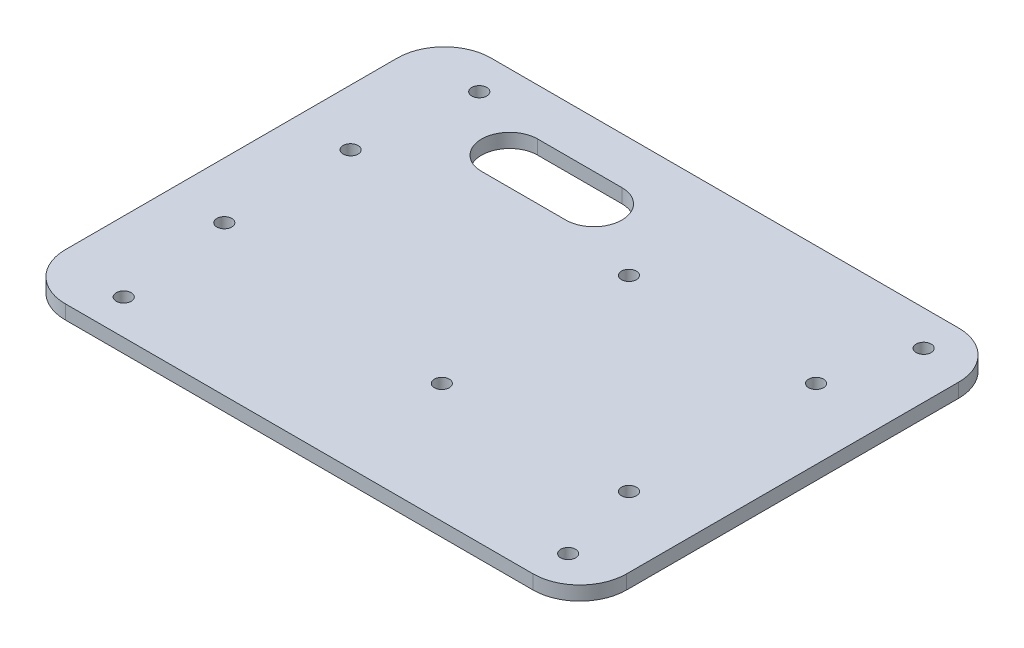
ISO-10303-21;
HEADER;
FILE_DESCRIPTION(('STEP AP214'),'2;1');
FILE_NAME('part.step','',(''),(''),'','','');
FILE_SCHEMA(('AUTOMOTIVE_DESIGN { 1 0 10303 214 1 1 1 1 }'));
ENDSEC;
DATA;
#1=APPLICATION_CONTEXT('core data for automotive mechanical design processes');
#2=APPLICATION_PROTOCOL_DEFINITION('international standard','automotive_design',2000,#1);
#3=PRODUCT_CONTEXT('',#1,'mechanical');
#4=PRODUCT('Part','Part','',(#3));
#5=PRODUCT_RELATED_PRODUCT_CATEGORY('part','',(#4));
#6=PRODUCT_DEFINITION_FORMATION('','',#4);
#7=PRODUCT_DEFINITION_CONTEXT('part definition',#1,'design');
#8=PRODUCT_DEFINITION('design','',#6,#7);
#9=PRODUCT_DEFINITION_SHAPE('','',#8);
#10=(LENGTH_UNIT() NAMED_UNIT(*) SI_UNIT(.MILLI.,.METRE.));
#11=(NAMED_UNIT(*) PLANE_ANGLE_UNIT() SI_UNIT($,.RADIAN.));
#12=(NAMED_UNIT(*) SI_UNIT($,.STERADIAN.) SOLID_ANGLE_UNIT());
#13=UNCERTAINTY_MEASURE_WITH_UNIT(LENGTH_MEASURE(1.E-05),#10,'distance_accuracy_value','');
#14=(GEOMETRIC_REPRESENTATION_CONTEXT(3) GLOBAL_UNCERTAINTY_ASSIGNED_CONTEXT((#13)) GLOBAL_UNIT_ASSIGNED_CONTEXT((#10,
#11,#12)) REPRESENTATION_CONTEXT('',''));
#15=CARTESIAN_POINT('',(0.,0.,0.));
#16=DIRECTION('',(0.,0.,1.));
#17=DIRECTION('',(1.,0.,0.));
#18=AXIS2_PLACEMENT_3D('',#15,#16,#17);
#19=CARTESIAN_POINT('',(-50.,3.,35.5));
#20=DIRECTION('',(0.,-1.,0.));
#21=DIRECTION('',(0.,0.,-1.));
#22=AXIS2_PLACEMENT_3D('',#19,#20,#21);
#23=CYLINDRICAL_SURFACE('',#22,10.);
#24=CARTESIAN_POINT('',(-50.,0.,35.5));
#25=DIRECTION('',(0.,-1.,0.));
#26=DIRECTION('',(0.,0.,-1.));
#27=AXIS2_PLACEMENT_3D('',#24,#25,#26);
#28=CIRCLE('',#27,10.);
#29=CARTESIAN_POINT('',(-49.9999999999999,0.,45.5));
#30=VERTEX_POINT('',#29);
#31=CARTESIAN_POINT('',(-60.,0.,35.4999999999999));
#32=VERTEX_POINT('',#31);
#33=EDGE_CURVE('E247',#30,#32,#28,.T.);
#34=ORIENTED_EDGE('',*,*,#33,.F.);
#35=DIRECTION('',(0.,-1.,0.));
#36=VECTOR('',#35,1.);
#37=CARTESIAN_POINT('',(-49.9999999999999,3.,45.5));
#38=LINE('',#37,#36);
#39=CARTESIAN_POINT('',(-49.9999999999999,3.,45.5));
#40=VERTEX_POINT('',#39);
#41=EDGE_CURVE('E11',#40,#30,#38,.T.);
#42=ORIENTED_EDGE('',*,*,#41,.F.);
#43=CARTESIAN_POINT('',(-50.,3.,35.5));
#44=DIRECTION('',(0.,-1.,0.));
#45=DIRECTION('',(0.,0.,-1.));
#46=AXIS2_PLACEMENT_3D('',#43,#44,#45);
#47=CIRCLE('',#46,10.);
#48=CARTESIAN_POINT('',(-60.,3.,35.4999999999999));
#49=VERTEX_POINT('',#48);
#50=EDGE_CURVE('E251',#40,#49,#47,.T.);
#51=ORIENTED_EDGE('',*,*,#50,.T.);
#52=DIRECTION('',(0.,-1.,0.));
#53=VECTOR('',#52,1.);
#54=CARTESIAN_POINT('',(-60.,3.,35.4999999999999));
#55=LINE('',#54,#53);
#56=EDGE_CURVE('E47',#49,#32,#55,.T.);
#57=ORIENTED_EDGE('',*,*,#56,.T.);
#58=EDGE_LOOP('',(#34,#42,#51,#57));
#59=FACE_BOUND('',#58,.T.);
#60=ADVANCED_FACE('F44',(#59),#23,.T.);
#61=CARTESIAN_POINT('',(-49.9999999999999,3.,45.5));
#62=DIRECTION('',(0.,0.,-1.));
#63=DIRECTION('',(-1.,0.,0.));
#64=AXIS2_PLACEMENT_3D('',#61,#62,#63);
#65=PLANE('',#64);
#66=DIRECTION('',(1.,0.,0.));
#67=VECTOR('',#66,1.);
#68=CARTESIAN_POINT('',(-49.9999999999999,0.,45.5));
#69=LINE('',#68,#67);
#70=CARTESIAN_POINT('',(49.9999999999999,0.,45.5));
#71=VERTEX_POINT('',#70);
#72=EDGE_CURVE('E256',#30,#71,#69,.T.);
#73=ORIENTED_EDGE('',*,*,#72,.T.);
#74=DIRECTION('',(0.,-1.,0.));
#75=VECTOR('',#74,1.);
#76=CARTESIAN_POINT('',(49.9999999999999,3.,45.5));
#77=LINE('',#76,#75);
#78=CARTESIAN_POINT('',(49.9999999999999,3.,45.5));
#79=VERTEX_POINT('',#78);
#80=EDGE_CURVE('E53',#79,#71,#77,.T.);
#81=ORIENTED_EDGE('',*,*,#80,.F.);
#82=DIRECTION('',(1.,0.,0.));
#83=VECTOR('',#82,1.);
#84=CARTESIAN_POINT('',(-49.9999999999999,3.,45.5));
#85=LINE('',#84,#83);
#86=EDGE_CURVE('E278',#40,#79,#85,.T.);
#87=ORIENTED_EDGE('',*,*,#86,.F.);
#88=ORIENTED_EDGE('',*,*,#41,.T.);
#89=EDGE_LOOP('',(#73,#81,#87,#88));
#90=FACE_BOUND('',#89,.T.);
#91=ADVANCED_FACE('F341',(#90),#65,.F.);
#92=CARTESIAN_POINT('',(50.,3.,35.5));
#93=DIRECTION('',(0.,-1.,0.));
#94=DIRECTION('',(0.,0.,-1.));
#95=AXIS2_PLACEMENT_3D('',#92,#93,#94);
#96=CYLINDRICAL_SURFACE('',#95,10.);
#97=CARTESIAN_POINT('',(50.,0.,35.5));
#98=DIRECTION('',(0.,1.,0.));
#99=DIRECTION('',(0.,0.,1.));
#100=AXIS2_PLACEMENT_3D('',#97,#98,#99);
#101=CIRCLE('',#100,10.);
#102=CARTESIAN_POINT('',(60.,0.,35.4999999999999));
#103=VERTEX_POINT('',#102);
#104=EDGE_CURVE('E304',#71,#103,#101,.T.);
#105=ORIENTED_EDGE('',*,*,#104,.T.);
#106=DIRECTION('',(0.,-1.,0.));
#107=VECTOR('',#106,1.);
#108=CARTESIAN_POINT('',(60.,3.,35.4999999999999));
#109=LINE('',#108,#107);
#110=CARTESIAN_POINT('',(60.,3.,35.4999999999999));
#111=VERTEX_POINT('',#110);
#112=EDGE_CURVE('E312',#111,#103,#109,.T.);
#113=ORIENTED_EDGE('',*,*,#112,.F.);
#114=CARTESIAN_POINT('',(50.,3.,35.5));
#115=DIRECTION('',(0.,1.,0.));
#116=DIRECTION('',(0.,0.,1.));
#117=AXIS2_PLACEMENT_3D('',#114,#115,#116);
#118=CIRCLE('',#117,10.);
#119=EDGE_CURVE('E275',#79,#111,#118,.T.);
#120=ORIENTED_EDGE('',*,*,#119,.F.);
#121=ORIENTED_EDGE('',*,*,#80,.T.);
#122=EDGE_LOOP('',(#105,#113,#120,#121));
#123=FACE_BOUND('',#122,.T.);
#124=ADVANCED_FACE('F345',(#123),#96,.T.);
#125=CARTESIAN_POINT('',(60.,3.,35.4999999999999));
#126=DIRECTION('',(-1.,0.,0.));
#127=DIRECTION('',(0.,0.,1.));
#128=AXIS2_PLACEMENT_3D('',#125,#126,#127);
#129=PLANE('',#128);
#130=DIRECTION('',(0.,0.,-1.));
#131=VECTOR('',#130,1.);
#132=CARTESIAN_POINT('',(60.,0.,35.4999999999999));
#133=LINE('',#132,#131);
#134=CARTESIAN_POINT('',(60.,0.,-35.4999999999999));
#135=VERTEX_POINT('',#134);
#136=EDGE_CURVE('E300',#103,#135,#133,.T.);
#137=ORIENTED_EDGE('',*,*,#136,.T.);
#138=DIRECTION('',(0.,-1.,0.));
#139=VECTOR('',#138,1.);
#140=CARTESIAN_POINT('',(60.,3.,-35.4999999999999));
#141=LINE('',#140,#139);
#142=CARTESIAN_POINT('',(60.,3.,-35.4999999999999));
#143=VERTEX_POINT('',#142);
#144=EDGE_CURVE('E316',#143,#135,#141,.T.);
#145=ORIENTED_EDGE('',*,*,#144,.F.);
#146=DIRECTION('',(0.,0.,-1.));
#147=VECTOR('',#146,1.);
#148=CARTESIAN_POINT('',(60.,3.,35.4999999999999));
#149=LINE('',#148,#147);
#150=EDGE_CURVE('E272',#111,#143,#149,.T.);
#151=ORIENTED_EDGE('',*,*,#150,.F.);
#152=ORIENTED_EDGE('',*,*,#112,.T.);
#153=EDGE_LOOP('',(#137,#145,#151,#152));
#154=FACE_BOUND('',#153,.T.);
#155=ADVANCED_FACE('F363',(#154),#129,.F.);
#156=CARTESIAN_POINT('',(50.,3.,-35.5));
#157=DIRECTION('',(0.,-1.,0.));
#158=DIRECTION('',(0.,0.,-1.));
#159=AXIS2_PLACEMENT_3D('',#156,#157,#158);
#160=CYLINDRICAL_SURFACE('',#159,10.);
#161=CARTESIAN_POINT('',(50.,0.,-35.5));
#162=DIRECTION('',(0.,-1.,0.));
#163=DIRECTION('',(0.,0.,-1.));
#164=AXIS2_PLACEMENT_3D('',#161,#162,#163);
#165=CIRCLE('',#164,10.);
#166=CARTESIAN_POINT('',(49.9999999999999,0.,-45.5));
#167=VERTEX_POINT('',#166);
#168=EDGE_CURVE('E296',#167,#135,#165,.T.);
#169=ORIENTED_EDGE('',*,*,#168,.F.);
#170=DIRECTION('',(0.,-1.,0.));
#171=VECTOR('',#170,1.);
#172=CARTESIAN_POINT('',(49.9999999999999,3.,-45.5));
#173=LINE('',#172,#171);
#174=CARTESIAN_POINT('',(49.9999999999999,3.,-45.5));
#175=VERTEX_POINT('',#174);
#176=EDGE_CURVE('E319',#175,#167,#173,.T.);
#177=ORIENTED_EDGE('',*,*,#176,.F.);
#178=CARTESIAN_POINT('',(50.,3.,-35.5));
#179=DIRECTION('',(0.,-1.,0.));
#180=DIRECTION('',(0.,0.,-1.));
#181=AXIS2_PLACEMENT_3D('',#178,#179,#180);
#182=CIRCLE('',#181,10.);
#183=EDGE_CURVE('E268',#175,#143,#182,.T.);
#184=ORIENTED_EDGE('',*,*,#183,.T.);
#185=ORIENTED_EDGE('',*,*,#144,.T.);
#186=EDGE_LOOP('',(#169,#177,#184,#185));
#187=FACE_BOUND('',#186,.T.);
#188=ADVANCED_FACE('F361',(#187),#160,.T.);
#189=CARTESIAN_POINT('',(-49.9999999999999,3.,-45.5));
#190=DIRECTION('',(0.,0.,-1.));
#191=DIRECTION('',(-1.,0.,0.));
#192=AXIS2_PLACEMENT_3D('',#189,#190,#191);
#193=PLANE('',#192);
#194=DIRECTION('',(1.,0.,0.));
#195=VECTOR('',#194,1.);
#196=CARTESIAN_POINT('',(-49.9999999999999,0.,-45.5));
#197=LINE('',#196,#195);
#198=CARTESIAN_POINT('',(-50.,0.,-45.5));
#199=VERTEX_POINT('',#198);
#200=EDGE_CURVE('E292',#199,#167,#197,.T.);
#201=ORIENTED_EDGE('',*,*,#200,.F.);
#202=DIRECTION('',(0.,-1.,0.));
#203=VECTOR('',#202,1.);
#204=CARTESIAN_POINT('',(-50.,3.,-45.5));
#205=LINE('',#204,#203);
#206=CARTESIAN_POINT('',(-50.,3.,-45.5));
#207=VERTEX_POINT('',#206);
#208=EDGE_CURVE('E322',#207,#199,#205,.T.);
#209=ORIENTED_EDGE('',*,*,#208,.F.);
#210=DIRECTION('',(1.,0.,0.));
#211=VECTOR('',#210,1.);
#212=CARTESIAN_POINT('',(-49.9999999999999,3.,-45.5));
#213=LINE('',#212,#211);
#214=EDGE_CURVE('E264',#207,#175,#213,.T.);
#215=ORIENTED_EDGE('',*,*,#214,.T.);
#216=ORIENTED_EDGE('',*,*,#176,.T.);
#217=EDGE_LOOP('',(#201,#209,#215,#216));
#218=FACE_BOUND('',#217,.T.);
#219=ADVANCED_FACE('F359',(#218),#193,.T.);
#220=CARTESIAN_POINT('',(-50.,3.,-35.5));
#221=DIRECTION('',(0.,-1.,0.));
#222=DIRECTION('',(0.,0.,-1.));
#223=AXIS2_PLACEMENT_3D('',#220,#221,#222);
#224=CYLINDRICAL_SURFACE('',#223,10.);
#225=CARTESIAN_POINT('',(-50.,0.,-35.5));
#226=DIRECTION('',(0.,-1.,0.));
#227=DIRECTION('',(0.,0.,-1.));
#228=AXIS2_PLACEMENT_3D('',#225,#226,#227);
#229=CIRCLE('',#228,10.);
#230=CARTESIAN_POINT('',(-60.,0.,-35.4999999999999));
#231=VERTEX_POINT('',#230);
#232=EDGE_CURVE('E288',#231,#199,#229,.T.);
#233=ORIENTED_EDGE('',*,*,#232,.F.);
#234=DIRECTION('',(0.,-1.,0.));
#235=VECTOR('',#234,1.);
#236=CARTESIAN_POINT('',(-60.,3.,-35.4999999999999));
#237=LINE('',#236,#235);
#238=CARTESIAN_POINT('',(-60.,3.,-35.4999999999999));
#239=VERTEX_POINT('',#238);
#240=EDGE_CURVE('E324',#239,#231,#237,.T.);
#241=ORIENTED_EDGE('',*,*,#240,.F.);
#242=CARTESIAN_POINT('',(-50.,3.,-35.5));
#243=DIRECTION('',(0.,-1.,0.));
#244=DIRECTION('',(0.,0.,-1.));
#245=AXIS2_PLACEMENT_3D('',#242,#243,#244);
#246=CIRCLE('',#245,10.);
#247=EDGE_CURVE('E260',#239,#207,#246,.T.);
#248=ORIENTED_EDGE('',*,*,#247,.T.);
#249=ORIENTED_EDGE('',*,*,#208,.T.);
#250=EDGE_LOOP('',(#233,#241,#248,#249));
#251=FACE_BOUND('',#250,.T.);
#252=ADVANCED_FACE('F355',(#251),#224,.T.);
#253=CARTESIAN_POINT('',(-60.,3.,35.4999999999999));
#254=DIRECTION('',(-1.,0.,0.));
#255=DIRECTION('',(0.,0.,1.));
#256=AXIS2_PLACEMENT_3D('',#253,#254,#255);
#257=PLANE('',#256);
#258=DIRECTION('',(0.,0.,-1.));
#259=VECTOR('',#258,1.);
#260=CARTESIAN_POINT('',(-60.,0.,35.4999999999999));
#261=LINE('',#260,#259);
#262=EDGE_CURVE('E284',#32,#231,#261,.T.);
#263=ORIENTED_EDGE('',*,*,#262,.F.);
#264=ORIENTED_EDGE('',*,*,#56,.F.);
#265=DIRECTION('',(0.,0.,-1.));
#266=VECTOR('',#265,1.);
#267=CARTESIAN_POINT('',(-60.,3.,35.4999999999999));
#268=LINE('',#267,#266);
#269=EDGE_CURVE('E255',#49,#239,#268,.T.);
#270=ORIENTED_EDGE('',*,*,#269,.T.);
#271=ORIENTED_EDGE('',*,*,#240,.T.);
#272=EDGE_LOOP('',(#263,#264,#270,#271));
#273=FACE_BOUND('',#272,.T.);
#274=ADVANCED_FACE('F334',(#273),#257,.T.);
#275=CARTESIAN_POINT('',(-50.,3.,35.5));
#276=DIRECTION('',(0.,-1.,0.));
#277=DIRECTION('',(0.,0.,-1.));
#278=AXIS2_PLACEMENT_3D('',#275,#276,#277);
#279=PLANE('',#278);
#280=CARTESIAN_POINT('',(-48.,3.,-13.5));
#281=DIRECTION('',(0.,1.,0.));
#282=DIRECTION('',(0.,0.,1.));
#283=AXIS2_PLACEMENT_3D('',#280,#281,#282);
#284=CIRCLE('',#283,1.6);
#285=CARTESIAN_POINT('',(-48.,3.,-11.9));
#286=VERTEX_POINT('',#285);
#287=EDGE_CURVE('E443',#286,#286,#284,.T.);
#288=ORIENTED_EDGE('',*,*,#287,.F.);
#289=EDGE_LOOP('',(#288));
#290=FACE_BOUND('',#289,.T.);
#291=CARTESIAN_POINT('',(-48.,3.,13.5));
#292=DIRECTION('',(0.,1.,0.));
#293=DIRECTION('',(0.,0.,1.));
#294=AXIS2_PLACEMENT_3D('',#291,#292,#293);
#295=CIRCLE('',#294,1.6);
#296=CARTESIAN_POINT('',(-48.,3.,15.1));
#297=VERTEX_POINT('',#296);
#298=EDGE_CURVE('E445',#297,#297,#295,.T.);
#299=ORIENTED_EDGE('',*,*,#298,.F.);
#300=EDGE_LOOP('',(#299));
#301=FACE_BOUND('',#300,.T.);
#302=DIRECTION('',(1.,0.,0.));
#303=VECTOR('',#302,1.);
#304=CARTESIAN_POINT('',(-30.,3.,-23.5));
#305=LINE('',#304,#303);
#306=CARTESIAN_POINT('',(-30.,3.,-23.5));
#307=VERTEX_POINT('',#306);
#308=CARTESIAN_POINT('',(-12.,3.,-23.5));
#309=VERTEX_POINT('',#308);
#310=EDGE_CURVE('E171',#307,#309,#305,.T.);
#311=ORIENTED_EDGE('',*,*,#310,.F.);
#312=CARTESIAN_POINT('',(-30.,3.,-29.5));
#313=DIRECTION('',(0.,1.,0.));
#314=DIRECTION('',(0.,0.,1.));
#315=AXIS2_PLACEMENT_3D('',#312,#313,#314);
#316=CIRCLE('',#315,6.00000000000001);
#317=CARTESIAN_POINT('',(-30.,3.,-35.5));
#318=VERTEX_POINT('',#317);
#319=EDGE_CURVE('E61',#318,#307,#316,.T.);
#320=ORIENTED_EDGE('',*,*,#319,.F.);
#321=DIRECTION('',(-1.,0.,0.));
#322=VECTOR('',#321,1.);
#323=CARTESIAN_POINT('',(-30.,3.,-35.5));
#324=LINE('',#323,#322);
#325=CARTESIAN_POINT('',(-12.,3.,-35.5));
#326=VERTEX_POINT('',#325);
#327=EDGE_CURVE('E155',#326,#318,#324,.T.);
#328=ORIENTED_EDGE('',*,*,#327,.F.);
#329=CARTESIAN_POINT('',(-12.,3.,-29.5));
#330=DIRECTION('',(0.,1.,0.));
#331=DIRECTION('',(0.,0.,1.));
#332=AXIS2_PLACEMENT_3D('',#329,#330,#331);
#333=CIRCLE('',#332,6.);
#334=EDGE_CURVE('E159',#309,#326,#333,.T.);
#335=ORIENTED_EDGE('',*,*,#334,.F.);
#336=EDGE_LOOP('',(#311,#320,#328,#335));
#337=FACE_BOUND('',#336,.T.);
#338=CARTESIAN_POINT('',(45.,3.,20.));
#339=DIRECTION('',(0.,1.,0.));
#340=DIRECTION('',(0.,0.,1.));
#341=AXIS2_PLACEMENT_3D('',#338,#339,#340);
#342=CIRCLE('',#341,1.6);
#343=CARTESIAN_POINT('',(45.,3.,21.6));
#344=VERTEX_POINT('',#343);
#345=EDGE_CURVE('E195',#344,#344,#342,.T.);
#346=ORIENTED_EDGE('',*,*,#345,.F.);
#347=EDGE_LOOP('',(#346));
#348=FACE_BOUND('',#347,.T.);
#349=CARTESIAN_POINT('',(5.,3.,-20.));
#350=DIRECTION('',(0.,1.,0.));
#351=DIRECTION('',(0.,0.,1.));
#352=AXIS2_PLACEMENT_3D('',#349,#350,#351);
#353=CIRCLE('',#352,1.6);
#354=CARTESIAN_POINT('',(5.,3.,-18.4));
#355=VERTEX_POINT('',#354);
#356=EDGE_CURVE('E204',#355,#355,#353,.T.);
#357=ORIENTED_EDGE('',*,*,#356,.F.);
#358=EDGE_LOOP('',(#357));
#359=FACE_BOUND('',#358,.T.);
#360=CARTESIAN_POINT('',(5.,3.,20.));
#361=DIRECTION('',(0.,1.,0.));
#362=DIRECTION('',(0.,0.,1.));
#363=AXIS2_PLACEMENT_3D('',#360,#361,#362);
#364=CIRCLE('',#363,1.6);
#365=CARTESIAN_POINT('',(5.,3.,21.6));
#366=VERTEX_POINT('',#365);
#367=EDGE_CURVE('E187',#366,#366,#364,.T.);
#368=ORIENTED_EDGE('',*,*,#367,.F.);
#369=EDGE_LOOP('',(#368));
#370=FACE_BOUND('',#369,.T.);
#371=CARTESIAN_POINT('',(45.,3.,-20.));
#372=DIRECTION('',(0.,1.,0.));
#373=DIRECTION('',(0.,0.,1.));
#374=AXIS2_PLACEMENT_3D('',#371,#372,#373);
#375=CIRCLE('',#374,1.6);
#376=CARTESIAN_POINT('',(45.,3.,-18.4));
#377=VERTEX_POINT('',#376);
#378=EDGE_CURVE('E199',#377,#377,#375,.T.);
#379=ORIENTED_EDGE('',*,*,#378,.F.);
#380=EDGE_LOOP('',(#379));
#381=FACE_BOUND('',#380,.T.);
#382=CARTESIAN_POINT('',(-45.,3.,38.));
#383=DIRECTION('',(0.,1.,0.));
#384=DIRECTION('',(0.,0.,1.));
#385=AXIS2_PLACEMENT_3D('',#382,#383,#384);
#386=CIRCLE('',#385,1.6);
#387=CARTESIAN_POINT('',(-45.,3.,39.6));
#388=VERTEX_POINT('',#387);
#389=EDGE_CURVE('E236',#388,#388,#386,.T.);
#390=ORIENTED_EDGE('',*,*,#389,.F.);
#391=EDGE_LOOP('',(#390));
#392=FACE_BOUND('',#391,.T.);
#393=CARTESIAN_POINT('',(-45.,3.,-38.));
#394=DIRECTION('',(0.,1.,0.));
#395=DIRECTION('',(0.,0.,1.));
#396=AXIS2_PLACEMENT_3D('',#393,#394,#395);
#397=CIRCLE('',#396,1.6);
#398=CARTESIAN_POINT('',(-45.,3.,-36.4));
#399=VERTEX_POINT('',#398);
#400=EDGE_CURVE('E228',#399,#399,#397,.T.);
#401=ORIENTED_EDGE('',*,*,#400,.F.);
#402=EDGE_LOOP('',(#401));
#403=FACE_BOUND('',#402,.T.);
#404=CARTESIAN_POINT('',(50.,3.,-38.));
#405=DIRECTION('',(0.,1.,0.));
#406=DIRECTION('',(0.,0.,1.));
#407=AXIS2_PLACEMENT_3D('',#404,#405,#406);
#408=CIRCLE('',#407,1.6);
#409=CARTESIAN_POINT('',(50.,3.,-36.4));
#410=VERTEX_POINT('',#409);
#411=EDGE_CURVE('E219',#410,#410,#408,.T.);
#412=ORIENTED_EDGE('',*,*,#411,.F.);
#413=EDGE_LOOP('',(#412));
#414=FACE_BOUND('',#413,.T.);
#415=CARTESIAN_POINT('',(50.,3.,38.));
#416=DIRECTION('',(0.,1.,0.));
#417=DIRECTION('',(0.,0.,1.));
#418=AXIS2_PLACEMENT_3D('',#415,#416,#417);
#419=CIRCLE('',#418,1.6);
#420=CARTESIAN_POINT('',(50.,3.,39.6));
#421=VERTEX_POINT('',#420);
#422=EDGE_CURVE('E223',#421,#421,#419,.T.);
#423=ORIENTED_EDGE('',*,*,#422,.F.);
#424=EDGE_LOOP('',(#423));
#425=FACE_BOUND('',#424,.T.);
#426=ORIENTED_EDGE('',*,*,#50,.F.);
#427=ORIENTED_EDGE('',*,*,#86,.T.);
#428=ORIENTED_EDGE('',*,*,#119,.T.);
#429=ORIENTED_EDGE('',*,*,#150,.T.);
#430=ORIENTED_EDGE('',*,*,#183,.F.);
#431=ORIENTED_EDGE('',*,*,#214,.F.);
#432=ORIENTED_EDGE('',*,*,#247,.F.);
#433=ORIENTED_EDGE('',*,*,#269,.F.);
#434=EDGE_LOOP('',(#426,#427,#428,#429,#430,#431,#432,#433));
#435=FACE_BOUND('',#434,.T.);
#436=ADVANCED_FACE('F349',(#290,#301,#337,#348,#359,#370,#381,#392,#403,#414,#425,#435),#279,.F.);
#437=CARTESIAN_POINT('',(-50.,0.,35.5));
#438=DIRECTION('',(0.,-1.,0.));
#439=DIRECTION('',(0.,0.,-1.));
#440=AXIS2_PLACEMENT_3D('',#437,#438,#439);
#441=PLANE('',#440);
#442=CARTESIAN_POINT('',(-48.,0.,-13.5));
#443=DIRECTION('',(0.,1.,0.));
#444=DIRECTION('',(0.,0.,1.));
#445=AXIS2_PLACEMENT_3D('',#442,#443,#444);
#446=CIRCLE('',#445,1.6);
#447=CARTESIAN_POINT('',(-48.,0.,-11.9));
#448=VERTEX_POINT('',#447);
#449=EDGE_CURVE('E172',#448,#448,#446,.T.);
#450=ORIENTED_EDGE('',*,*,#449,.T.);
#451=EDGE_LOOP('',(#450));
#452=FACE_BOUND('',#451,.T.);
#453=CARTESIAN_POINT('',(-48.,0.,13.5));
#454=DIRECTION('',(0.,1.,0.));
#455=DIRECTION('',(0.,0.,1.));
#456=AXIS2_PLACEMENT_3D('',#453,#454,#455);
#457=CIRCLE('',#456,1.6);
#458=CARTESIAN_POINT('',(-48.,0.,15.1));
#459=VERTEX_POINT('',#458);
#460=EDGE_CURVE('E162',#459,#459,#457,.T.);
#461=ORIENTED_EDGE('',*,*,#460,.T.);
#462=EDGE_LOOP('',(#461));
#463=FACE_BOUND('',#462,.T.);
#464=CARTESIAN_POINT('',(-30.,0.,-29.5));
#465=DIRECTION('',(0.,1.,0.));
#466=DIRECTION('',(0.,0.,1.));
#467=AXIS2_PLACEMENT_3D('',#464,#465,#466);
#468=CIRCLE('',#467,6.00000000000001);
#469=CARTESIAN_POINT('',(-30.,0.,-35.5));
#470=VERTEX_POINT('',#469);
#471=CARTESIAN_POINT('',(-30.,0.,-23.5));
#472=VERTEX_POINT('',#471);
#473=EDGE_CURVE('E136',#470,#472,#468,.T.);
#474=ORIENTED_EDGE('',*,*,#473,.T.);
#475=DIRECTION('',(1.,0.,0.));
#476=VECTOR('',#475,1.);
#477=CARTESIAN_POINT('',(-30.,0.,-23.5));
#478=LINE('',#477,#476);
#479=CARTESIAN_POINT('',(-12.,0.,-23.5));
#480=VERTEX_POINT('',#479);
#481=EDGE_CURVE('E146',#472,#480,#478,.T.);
#482=ORIENTED_EDGE('',*,*,#481,.T.);
#483=CARTESIAN_POINT('',(-12.,0.,-29.5));
#484=DIRECTION('',(0.,1.,0.));
#485=DIRECTION('',(0.,0.,1.));
#486=AXIS2_PLACEMENT_3D('',#483,#484,#485);
#487=CIRCLE('',#486,6.);
#488=CARTESIAN_POINT('',(-12.,0.,-35.5));
#489=VERTEX_POINT('',#488);
#490=EDGE_CURVE('E69',#480,#489,#487,.T.);
#491=ORIENTED_EDGE('',*,*,#490,.T.);
#492=DIRECTION('',(-1.,0.,0.));
#493=VECTOR('',#492,1.);
#494=CARTESIAN_POINT('',(-30.,0.,-35.5));
#495=LINE('',#494,#493);
#496=EDGE_CURVE('E143',#489,#470,#495,.T.);
#497=ORIENTED_EDGE('',*,*,#496,.T.);
#498=EDGE_LOOP('',(#474,#482,#491,#497));
#499=FACE_BOUND('',#498,.T.);
#500=CARTESIAN_POINT('',(45.,0.,20.));
#501=DIRECTION('',(0.,1.,0.));
#502=DIRECTION('',(0.,0.,1.));
#503=AXIS2_PLACEMENT_3D('',#500,#501,#502);
#504=CIRCLE('',#503,1.6);
#505=CARTESIAN_POINT('',(45.,0.,21.6));
#506=VERTEX_POINT('',#505);
#507=EDGE_CURVE('E200',#506,#506,#504,.T.);
#508=ORIENTED_EDGE('',*,*,#507,.T.);
#509=EDGE_LOOP('',(#508));
#510=FACE_BOUND('',#509,.T.);
#511=CARTESIAN_POINT('',(5.,0.,-20.));
#512=DIRECTION('',(0.,1.,0.));
#513=DIRECTION('',(0.,0.,1.));
#514=AXIS2_PLACEMENT_3D('',#511,#512,#513);
#515=CIRCLE('',#514,1.6);
#516=CARTESIAN_POINT('',(5.,0.,-18.4));
#517=VERTEX_POINT('',#516);
#518=EDGE_CURVE('E191',#517,#517,#515,.T.);
#519=ORIENTED_EDGE('',*,*,#518,.T.);
#520=EDGE_LOOP('',(#519));
#521=FACE_BOUND('',#520,.T.);
#522=CARTESIAN_POINT('',(5.,0.,20.));
#523=DIRECTION('',(0.,1.,0.));
#524=DIRECTION('',(0.,0.,1.));
#525=AXIS2_PLACEMENT_3D('',#522,#523,#524);
#526=CIRCLE('',#525,1.6);
#527=CARTESIAN_POINT('',(5.,0.,21.6));
#528=VERTEX_POINT('',#527);
#529=EDGE_CURVE('E181',#528,#528,#526,.T.);
#530=ORIENTED_EDGE('',*,*,#529,.T.);
#531=EDGE_LOOP('',(#530));
#532=FACE_BOUND('',#531,.T.);
#533=CARTESIAN_POINT('',(45.,0.,-20.));
#534=DIRECTION('',(0.,1.,0.));
#535=DIRECTION('',(0.,0.,1.));
#536=AXIS2_PLACEMENT_3D('',#533,#534,#535);
#537=CIRCLE('',#536,1.6);
#538=CARTESIAN_POINT('',(45.,0.,-18.4));
#539=VERTEX_POINT('',#538);
#540=EDGE_CURVE('E211',#539,#539,#537,.T.);
#541=ORIENTED_EDGE('',*,*,#540,.T.);
#542=EDGE_LOOP('',(#541));
#543=FACE_BOUND('',#542,.T.);
#544=CARTESIAN_POINT('',(-45.,0.,38.));
#545=DIRECTION('',(0.,1.,0.));
#546=DIRECTION('',(0.,0.,1.));
#547=AXIS2_PLACEMENT_3D('',#544,#545,#546);
#548=CIRCLE('',#547,1.6);
#549=CARTESIAN_POINT('',(-45.,0.,39.6));
#550=VERTEX_POINT('',#549);
#551=EDGE_CURVE('E215',#550,#550,#548,.T.);
#552=ORIENTED_EDGE('',*,*,#551,.T.);
#553=EDGE_LOOP('',(#552));
#554=FACE_BOUND('',#553,.T.);
#555=CARTESIAN_POINT('',(-45.,0.,-38.));
#556=DIRECTION('',(0.,1.,0.));
#557=DIRECTION('',(0.,0.,1.));
#558=AXIS2_PLACEMENT_3D('',#555,#556,#557);
#559=CIRCLE('',#558,1.6);
#560=CARTESIAN_POINT('',(-45.,0.,-36.4));
#561=VERTEX_POINT('',#560);
#562=EDGE_CURVE('E232',#561,#561,#559,.T.);
#563=ORIENTED_EDGE('',*,*,#562,.T.);
#564=EDGE_LOOP('',(#563));
#565=FACE_BOUND('',#564,.T.);
#566=CARTESIAN_POINT('',(50.,0.,-38.));
#567=DIRECTION('',(0.,1.,0.));
#568=DIRECTION('',(0.,0.,1.));
#569=AXIS2_PLACEMENT_3D('',#566,#567,#568);
#570=CIRCLE('',#569,1.6);
#571=CARTESIAN_POINT('',(50.,0.,-36.4));
#572=VERTEX_POINT('',#571);
#573=EDGE_CURVE('E224',#572,#572,#570,.T.);
#574=ORIENTED_EDGE('',*,*,#573,.T.);
#575=EDGE_LOOP('',(#574));
#576=FACE_BOUND('',#575,.T.);
#577=CARTESIAN_POINT('',(50.,0.,38.));
#578=DIRECTION('',(0.,1.,0.));
#579=DIRECTION('',(0.,0.,1.));
#580=AXIS2_PLACEMENT_3D('',#577,#578,#579);
#581=CIRCLE('',#580,1.6);
#582=CARTESIAN_POINT('',(50.,0.,39.6));
#583=VERTEX_POINT('',#582);
#584=EDGE_CURVE('E243',#583,#583,#581,.T.);
#585=ORIENTED_EDGE('',*,*,#584,.T.);
#586=EDGE_LOOP('',(#585));
#587=FACE_BOUND('',#586,.T.);
#588=ORIENTED_EDGE('',*,*,#33,.T.);
#589=ORIENTED_EDGE('',*,*,#262,.T.);
#590=ORIENTED_EDGE('',*,*,#232,.T.);
#591=ORIENTED_EDGE('',*,*,#200,.T.);
#592=ORIENTED_EDGE('',*,*,#168,.T.);
#593=ORIENTED_EDGE('',*,*,#136,.F.);
#594=ORIENTED_EDGE('',*,*,#104,.F.);
#595=ORIENTED_EDGE('',*,*,#72,.F.);
#596=EDGE_LOOP('',(#588,#589,#590,#591,#592,#593,#594,#595));
#597=FACE_BOUND('',#596,.T.);
#598=ADVANCED_FACE('F151',(#452,#463,#499,#510,#521,#532,#543,#554,#565,#576,#587,#597),#441,.T.);
#599=CARTESIAN_POINT('',(50.,0.,38.));
#600=DIRECTION('',(0.,1.,0.));
#601=DIRECTION('',(0.,0.,1.));
#602=AXIS2_PLACEMENT_3D('',#599,#600,#601);
#603=CYLINDRICAL_SURFACE('',#602,1.6);
#604=ORIENTED_EDGE('',*,*,#584,.F.);
#605=EDGE_LOOP('',(#604));
#606=FACE_BOUND('',#605,.T.);
#607=ORIENTED_EDGE('',*,*,#422,.T.);
#608=EDGE_LOOP('',(#607));
#609=FACE_BOUND('',#608,.T.);
#610=ADVANCED_FACE('F382',(#606,#609),#603,.F.);
#611=CARTESIAN_POINT('',(50.,0.,-38.));
#612=DIRECTION('',(0.,1.,0.));
#613=DIRECTION('',(0.,0.,1.));
#614=AXIS2_PLACEMENT_3D('',#611,#612,#613);
#615=CYLINDRICAL_SURFACE('',#614,1.6);
#616=ORIENTED_EDGE('',*,*,#573,.F.);
#617=EDGE_LOOP('',(#616));
#618=FACE_BOUND('',#617,.T.);
#619=ORIENTED_EDGE('',*,*,#411,.T.);
#620=EDGE_LOOP('',(#619));
#621=FACE_BOUND('',#620,.T.);
#622=ADVANCED_FACE('F389',(#618,#621),#615,.F.);
#623=CARTESIAN_POINT('',(-45.,0.,-38.));
#624=DIRECTION('',(0.,1.,0.));
#625=DIRECTION('',(0.,0.,1.));
#626=AXIS2_PLACEMENT_3D('',#623,#624,#625);
#627=CYLINDRICAL_SURFACE('',#626,1.6);
#628=ORIENTED_EDGE('',*,*,#562,.F.);
#629=EDGE_LOOP('',(#628));
#630=FACE_BOUND('',#629,.T.);
#631=ORIENTED_EDGE('',*,*,#400,.T.);
#632=EDGE_LOOP('',(#631));
#633=FACE_BOUND('',#632,.T.);
#634=ADVANCED_FACE('F395',(#630,#633),#627,.F.);
#635=CARTESIAN_POINT('',(-45.,0.,38.));
#636=DIRECTION('',(0.,1.,0.));
#637=DIRECTION('',(0.,0.,1.));
#638=AXIS2_PLACEMENT_3D('',#635,#636,#637);
#639=CYLINDRICAL_SURFACE('',#638,1.6);
#640=ORIENTED_EDGE('',*,*,#551,.F.);
#641=EDGE_LOOP('',(#640));
#642=FACE_BOUND('',#641,.T.);
#643=ORIENTED_EDGE('',*,*,#389,.T.);
#644=EDGE_LOOP('',(#643));
#645=FACE_BOUND('',#644,.T.);
#646=ADVANCED_FACE('F391',(#642,#645),#639,.F.);
#647=CARTESIAN_POINT('',(45.,0.,-20.));
#648=DIRECTION('',(0.,1.,0.));
#649=DIRECTION('',(0.,0.,1.));
#650=AXIS2_PLACEMENT_3D('',#647,#648,#649);
#651=CYLINDRICAL_SURFACE('',#650,1.6);
#652=ORIENTED_EDGE('',*,*,#540,.F.);
#653=EDGE_LOOP('',(#652));
#654=FACE_BOUND('',#653,.T.);
#655=ORIENTED_EDGE('',*,*,#378,.T.);
#656=EDGE_LOOP('',(#655));
#657=FACE_BOUND('',#656,.T.);
#658=ADVANCED_FACE('F394',(#654,#657),#651,.F.);
#659=CARTESIAN_POINT('',(5.,0.,20.));
#660=DIRECTION('',(0.,1.,0.));
#661=DIRECTION('',(0.,0.,1.));
#662=AXIS2_PLACEMENT_3D('',#659,#660,#661);
#663=CYLINDRICAL_SURFACE('',#662,1.6);
#664=ORIENTED_EDGE('',*,*,#529,.F.);
#665=EDGE_LOOP('',(#664));
#666=FACE_BOUND('',#665,.T.);
#667=ORIENTED_EDGE('',*,*,#367,.T.);
#668=EDGE_LOOP('',(#667));
#669=FACE_BOUND('',#668,.T.);
#670=ADVANCED_FACE('F405',(#666,#669),#663,.F.);
#671=CARTESIAN_POINT('',(5.,0.,-20.));
#672=DIRECTION('',(0.,1.,0.));
#673=DIRECTION('',(0.,0.,1.));
#674=AXIS2_PLACEMENT_3D('',#671,#672,#673);
#675=CYLINDRICAL_SURFACE('',#674,1.6);
#676=ORIENTED_EDGE('',*,*,#518,.F.);
#677=EDGE_LOOP('',(#676));
#678=FACE_BOUND('',#677,.T.);
#679=ORIENTED_EDGE('',*,*,#356,.T.);
#680=EDGE_LOOP('',(#679));
#681=FACE_BOUND('',#680,.T.);
#682=ADVANCED_FACE('F407',(#678,#681),#675,.F.);
#683=CARTESIAN_POINT('',(45.,0.,20.));
#684=DIRECTION('',(0.,1.,0.));
#685=DIRECTION('',(0.,0.,1.));
#686=AXIS2_PLACEMENT_3D('',#683,#684,#685);
#687=CYLINDRICAL_SURFACE('',#686,1.6);
#688=ORIENTED_EDGE('',*,*,#507,.F.);
#689=EDGE_LOOP('',(#688));
#690=FACE_BOUND('',#689,.T.);
#691=ORIENTED_EDGE('',*,*,#345,.T.);
#692=EDGE_LOOP('',(#691));
#693=FACE_BOUND('',#692,.T.);
#694=ADVANCED_FACE('F410',(#690,#693),#687,.F.);
#695=CARTESIAN_POINT('',(-30.,0.,-29.5));
#696=DIRECTION('',(0.,1.,0.));
#697=DIRECTION('',(0.,0.,1.));
#698=AXIS2_PLACEMENT_3D('',#695,#696,#697);
#699=CYLINDRICAL_SURFACE('',#698,6.00000000000001);
#700=ORIENTED_EDGE('',*,*,#319,.T.);
#701=DIRECTION('',(0.,1.,0.));
#702=VECTOR('',#701,1.);
#703=CARTESIAN_POINT('',(-30.,0.,-23.5));
#704=LINE('',#703,#702);
#705=EDGE_CURVE('E132',#472,#307,#704,.T.);
#706=ORIENTED_EDGE('',*,*,#705,.F.);
#707=ORIENTED_EDGE('',*,*,#473,.F.);
#708=DIRECTION('',(0.,1.,0.));
#709=VECTOR('',#708,1.);
#710=CARTESIAN_POINT('',(-30.,0.,-35.5));
#711=LINE('',#710,#709);
#712=EDGE_CURVE('E178',#470,#318,#711,.T.);
#713=ORIENTED_EDGE('',*,*,#712,.T.);
#714=EDGE_LOOP('',(#700,#706,#707,#713));
#715=FACE_BOUND('',#714,.T.);
#716=ADVANCED_FACE('F134',(#715),#699,.F.);
#717=CARTESIAN_POINT('',(-30.,0.,-35.5));
#718=DIRECTION('',(0.,0.,-1.));
#719=DIRECTION('',(-1.,0.,0.));
#720=AXIS2_PLACEMENT_3D('',#717,#718,#719);
#721=PLANE('',#720);
#722=ORIENTED_EDGE('',*,*,#327,.T.);
#723=ORIENTED_EDGE('',*,*,#712,.F.);
#724=ORIENTED_EDGE('',*,*,#496,.F.);
#725=DIRECTION('',(0.,1.,0.));
#726=VECTOR('',#725,1.);
#727=CARTESIAN_POINT('',(-12.,0.,-35.5));
#728=LINE('',#727,#726);
#729=EDGE_CURVE('E182',#489,#326,#728,.T.);
#730=ORIENTED_EDGE('',*,*,#729,.T.);
#731=EDGE_LOOP('',(#722,#723,#724,#730));
#732=FACE_BOUND('',#731,.T.);
#733=ADVANCED_FACE('F420',(#732),#721,.F.);
#734=CARTESIAN_POINT('',(-12.,0.,-29.5));
#735=DIRECTION('',(0.,1.,0.));
#736=DIRECTION('',(0.,0.,1.));
#737=AXIS2_PLACEMENT_3D('',#734,#735,#736);
#738=CYLINDRICAL_SURFACE('',#737,6.);
#739=ORIENTED_EDGE('',*,*,#334,.T.);
#740=ORIENTED_EDGE('',*,*,#729,.F.);
#741=ORIENTED_EDGE('',*,*,#490,.F.);
#742=DIRECTION('',(0.,1.,0.));
#743=VECTOR('',#742,1.);
#744=CARTESIAN_POINT('',(-12.,0.,-23.5));
#745=LINE('',#744,#743);
#746=EDGE_CURVE('E142',#480,#309,#745,.T.);
#747=ORIENTED_EDGE('',*,*,#746,.T.);
#748=EDGE_LOOP('',(#739,#740,#741,#747));
#749=FACE_BOUND('',#748,.T.);
#750=ADVANCED_FACE('F424',(#749),#738,.F.);
#751=CARTESIAN_POINT('',(-30.,0.,-23.5));
#752=DIRECTION('',(0.,0.,1.));
#753=DIRECTION('',(1.,0.,0.));
#754=AXIS2_PLACEMENT_3D('',#751,#752,#753);
#755=PLANE('',#754);
#756=ORIENTED_EDGE('',*,*,#310,.T.);
#757=ORIENTED_EDGE('',*,*,#746,.F.);
#758=ORIENTED_EDGE('',*,*,#481,.F.);
#759=ORIENTED_EDGE('',*,*,#705,.T.);
#760=EDGE_LOOP('',(#756,#757,#758,#759));
#761=FACE_BOUND('',#760,.T.);
#762=ADVANCED_FACE('F147',(#761),#755,.F.);
#763=CARTESIAN_POINT('',(-48.,0.,13.5));
#764=DIRECTION('',(0.,1.,0.));
#765=DIRECTION('',(0.,0.,1.));
#766=AXIS2_PLACEMENT_3D('',#763,#764,#765);
#767=CYLINDRICAL_SURFACE('',#766,1.6);
#768=ORIENTED_EDGE('',*,*,#460,.F.);
#769=EDGE_LOOP('',(#768));
#770=FACE_BOUND('',#769,.T.);
#771=ORIENTED_EDGE('',*,*,#298,.T.);
#772=EDGE_LOOP('',(#771));
#773=FACE_BOUND('',#772,.T.);
#774=ADVANCED_FACE('F423',(#770,#773),#767,.F.);
#775=CARTESIAN_POINT('',(-48.,0.,-13.5));
#776=DIRECTION('',(0.,1.,0.));
#777=DIRECTION('',(0.,0.,1.));
#778=AXIS2_PLACEMENT_3D('',#775,#776,#777);
#779=CYLINDRICAL_SURFACE('',#778,1.6);
#780=ORIENTED_EDGE('',*,*,#449,.F.);
#781=EDGE_LOOP('',(#780));
#782=FACE_BOUND('',#781,.T.);
#783=ORIENTED_EDGE('',*,*,#287,.T.);
#784=EDGE_LOOP('',(#783));
#785=FACE_BOUND('',#784,.T.);
#786=ADVANCED_FACE('F432',(#782,#785),#779,.F.);
#787=CLOSED_SHELL('',(#60,#91,#124,#155,#188,#219,#252,#274,#436,#598,#610,#622,#634,#646,#658,
#670,#682,#694,#716,#733,#750,#762,#774,#786));
#788=MANIFOLD_SOLID_BREP('B2',#787);
#789=ADVANCED_BREP_SHAPE_REPRESENTATION('',(#18,#788),#14);
#790=SHAPE_DEFINITION_REPRESENTATION(#9,#789);
ENDSEC;
END-ISO-10303-21;
